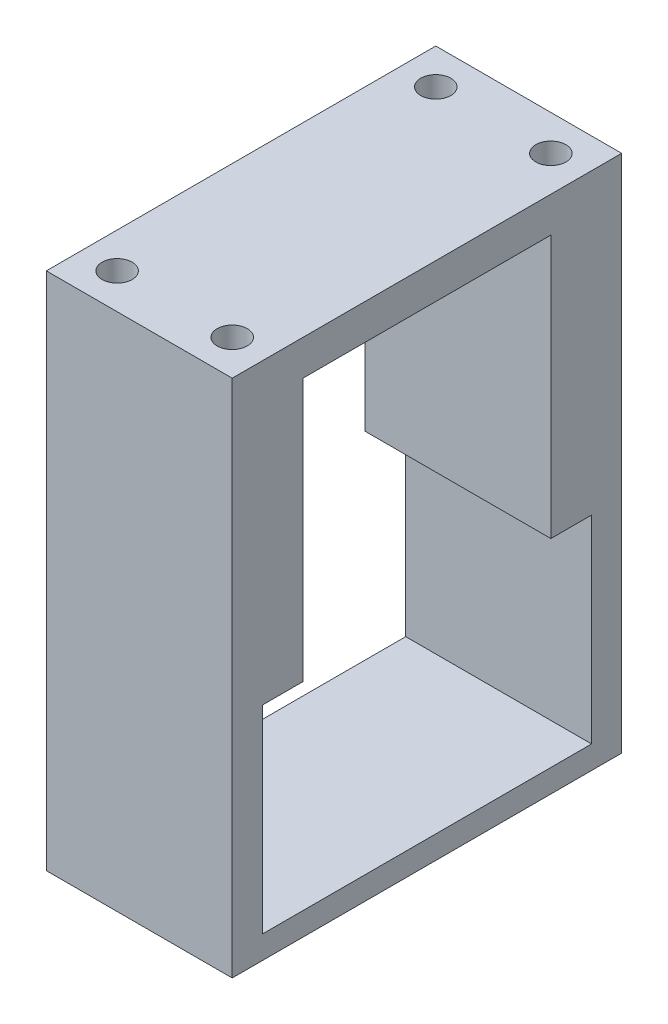
ISO-10303-21;
HEADER;
FILE_DESCRIPTION(('STEP AP214'),'2;1');
FILE_NAME('part.step','',(''),(''),'','','');
FILE_SCHEMA(('AUTOMOTIVE_DESIGN { 1 0 10303 214 1 1 1 1 }'));
ENDSEC;
DATA;
#1=APPLICATION_CONTEXT('core data for automotive mechanical design processes');
#2=APPLICATION_PROTOCOL_DEFINITION('international standard','automotive_design',2000,#1);
#3=PRODUCT_CONTEXT('',#1,'mechanical');
#4=PRODUCT('Part','Part','',(#3));
#5=PRODUCT_RELATED_PRODUCT_CATEGORY('part','',(#4));
#6=PRODUCT_DEFINITION_FORMATION('','',#4);
#7=PRODUCT_DEFINITION_CONTEXT('part definition',#1,'design');
#8=PRODUCT_DEFINITION('design','',#6,#7);
#9=PRODUCT_DEFINITION_SHAPE('','',#8);
#10=(LENGTH_UNIT() NAMED_UNIT(*) SI_UNIT(.MILLI.,.METRE.));
#11=(NAMED_UNIT(*) PLANE_ANGLE_UNIT() SI_UNIT($,.RADIAN.));
#12=(NAMED_UNIT(*) SI_UNIT($,.STERADIAN.) SOLID_ANGLE_UNIT());
#13=UNCERTAINTY_MEASURE_WITH_UNIT(LENGTH_MEASURE(1.E-05),#10,'distance_accuracy_value','');
#14=(GEOMETRIC_REPRESENTATION_CONTEXT(3) GLOBAL_UNCERTAINTY_ASSIGNED_CONTEXT((#13)) GLOBAL_UNIT_ASSIGNED_CONTEXT((#10,
#11,#12)) REPRESENTATION_CONTEXT('',''));
#15=CARTESIAN_POINT('',(0.,0.,0.));
#16=DIRECTION('',(0.,0.,1.));
#17=DIRECTION('',(1.,0.,0.));
#18=AXIS2_PLACEMENT_3D('',#15,#16,#17);
#19=CARTESIAN_POINT('',(200.,518.69,586.32));
#20=DIRECTION('',(0.,-1.,0.));
#21=DIRECTION('',(0.,0.,-1.));
#22=AXIS2_PLACEMENT_3D('',#19,#20,#21);
#23=PLANE('',#22);
#24=CARTESIAN_POINT('',(200.,518.69,586.32));
#25=DIRECTION('',(0.,-1.,0.));
#26=DIRECTION('',(1.,0.,0.));
#27=AXIS2_PLACEMENT_3D('',#24,#25,#26);
#28=CIRCLE('',#27,1.7);
#29=CARTESIAN_POINT('',(201.7,518.69,586.32));
#30=VERTEX_POINT('',#29);
#31=EDGE_CURVE('E9',#30,#30,#28,.T.);
#32=ORIENTED_EDGE('',*,*,#31,.F.);
#33=EDGE_LOOP('',(#32));
#34=FACE_BOUND('',#33,.T.);
#35=ADVANCED_FACE('F15',(#34),#23,.F.);
#36=CARTESIAN_POINT('',(200.,518.69,550.32));
#37=DIRECTION('',(0.,-1.,0.));
#38=DIRECTION('',(0.,0.,-1.));
#39=AXIS2_PLACEMENT_3D('',#36,#37,#38);
#40=PLANE('',#39);
#41=CARTESIAN_POINT('',(200.,518.69,550.32));
#42=DIRECTION('',(0.,-1.,0.));
#43=DIRECTION('',(1.,0.,0.));
#44=AXIS2_PLACEMENT_3D('',#41,#42,#43);
#45=CIRCLE('',#44,1.7);
#46=CARTESIAN_POINT('',(201.7,518.69,550.32));
#47=VERTEX_POINT('',#46);
#48=EDGE_CURVE('E45',#47,#47,#45,.T.);
#49=ORIENTED_EDGE('',*,*,#48,.F.);
#50=EDGE_LOOP('',(#49));
#51=FACE_BOUND('',#50,.T.);
#52=ADVANCED_FACE('F394',(#51),#40,.F.);
#53=CARTESIAN_POINT('',(187.,518.69,586.32));
#54=DIRECTION('',(0.,-1.,0.));
#55=DIRECTION('',(0.,0.,-1.));
#56=AXIS2_PLACEMENT_3D('',#53,#54,#55);
#57=PLANE('',#56);
#58=CARTESIAN_POINT('',(187.,518.69,586.32));
#59=DIRECTION('',(0.,-1.,0.));
#60=DIRECTION('',(1.,0.,0.));
#61=AXIS2_PLACEMENT_3D('',#58,#59,#60);
#62=CIRCLE('',#61,1.7);
#63=CARTESIAN_POINT('',(188.7,518.69,586.32));
#64=VERTEX_POINT('',#63);
#65=EDGE_CURVE('E120',#64,#64,#62,.T.);
#66=ORIENTED_EDGE('',*,*,#65,.F.);
#67=EDGE_LOOP('',(#66));
#68=FACE_BOUND('',#67,.T.);
#69=ADVANCED_FACE('F399',(#68),#57,.F.);
#70=CARTESIAN_POINT('',(187.,518.69,550.32));
#71=DIRECTION('',(0.,-1.,0.));
#72=DIRECTION('',(0.,0.,-1.));
#73=AXIS2_PLACEMENT_3D('',#70,#71,#72);
#74=PLANE('',#73);
#75=CARTESIAN_POINT('',(187.,518.69,550.32));
#76=DIRECTION('',(0.,-1.,0.));
#77=DIRECTION('',(1.,0.,0.));
#78=AXIS2_PLACEMENT_3D('',#75,#76,#77);
#79=CIRCLE('',#78,1.7);
#80=CARTESIAN_POINT('',(188.7,518.69,550.32));
#81=VERTEX_POINT('',#80);
#82=EDGE_CURVE('E108',#81,#81,#79,.T.);
#83=ORIENTED_EDGE('',*,*,#82,.F.);
#84=EDGE_LOOP('',(#83));
#85=FACE_BOUND('',#84,.T.);
#86=ADVANCED_FACE('F417',(#85),#74,.F.);
#87=CARTESIAN_POINT('',(200.,518.69,586.32));
#88=DIRECTION('',(0.,-1.,0.));
#89=DIRECTION('',(1.,0.,0.));
#90=AXIS2_PLACEMENT_3D('',#87,#88,#89);
#91=CYLINDRICAL_SURFACE('',#90,1.7);
#92=DIRECTION('',(0.,1.,0.));
#93=VECTOR('',#92,1.);
#94=CARTESIAN_POINT('',(201.7,518.69,586.32));
#95=LINE('',#94,#93);
#96=CARTESIAN_POINT('',(201.7,524.69,586.32));
#97=VERTEX_POINT('',#96);
#98=EDGE_CURVE('E23',#30,#97,#95,.T.);
#99=ORIENTED_EDGE('',*,*,#98,.T.);
#100=CARTESIAN_POINT('',(200.,524.69,586.32));
#101=DIRECTION('',(0.,-1.,0.));
#102=DIRECTION('',(1.,0.,0.));
#103=AXIS2_PLACEMENT_3D('',#100,#101,#102);
#104=CIRCLE('',#103,1.7);
#105=EDGE_CURVE('E196',#97,#97,#104,.T.);
#106=ORIENTED_EDGE('',*,*,#105,.F.);
#107=ORIENTED_EDGE('',*,*,#98,.F.);
#108=ORIENTED_EDGE('',*,*,#31,.T.);
#109=EDGE_LOOP('',(#99,#106,#107,#108));
#110=FACE_BOUND('',#109,.T.);
#111=ADVANCED_FACE('F401',(#110),#91,.F.);
#112=CARTESIAN_POINT('',(200.,518.69,550.32));
#113=DIRECTION('',(0.,-1.,0.));
#114=DIRECTION('',(1.,0.,0.));
#115=AXIS2_PLACEMENT_3D('',#112,#113,#114);
#116=CYLINDRICAL_SURFACE('',#115,1.7);
#117=DIRECTION('',(0.,1.,0.));
#118=VECTOR('',#117,1.);
#119=CARTESIAN_POINT('',(201.7,518.69,550.32));
#120=LINE('',#119,#118);
#121=CARTESIAN_POINT('',(201.7,524.69,550.32));
#122=VERTEX_POINT('',#121);
#123=EDGE_CURVE('E127',#47,#122,#120,.T.);
#124=ORIENTED_EDGE('',*,*,#123,.T.);
#125=CARTESIAN_POINT('',(200.,524.69,550.32));
#126=DIRECTION('',(0.,-1.,0.));
#127=DIRECTION('',(1.,0.,0.));
#128=AXIS2_PLACEMENT_3D('',#125,#126,#127);
#129=CIRCLE('',#128,1.7);
#130=EDGE_CURVE('E192',#122,#122,#129,.T.);
#131=ORIENTED_EDGE('',*,*,#130,.F.);
#132=ORIENTED_EDGE('',*,*,#123,.F.);
#133=ORIENTED_EDGE('',*,*,#48,.T.);
#134=EDGE_LOOP('',(#124,#131,#132,#133));
#135=FACE_BOUND('',#134,.T.);
#136=ADVANCED_FACE('F426',(#135),#116,.F.);
#137=CARTESIAN_POINT('',(187.,518.69,586.32));
#138=DIRECTION('',(0.,-1.,0.));
#139=DIRECTION('',(1.,0.,0.));
#140=AXIS2_PLACEMENT_3D('',#137,#138,#139);
#141=CYLINDRICAL_SURFACE('',#140,1.7);
#142=DIRECTION('',(0.,1.,0.));
#143=VECTOR('',#142,1.);
#144=CARTESIAN_POINT('',(188.7,518.69,586.32));
#145=LINE('',#144,#143);
#146=CARTESIAN_POINT('',(188.7,524.69,586.32));
#147=VERTEX_POINT('',#146);
#148=EDGE_CURVE('E115',#64,#147,#145,.T.);
#149=ORIENTED_EDGE('',*,*,#148,.T.);
#150=CARTESIAN_POINT('',(187.,524.69,586.32));
#151=DIRECTION('',(0.,-1.,0.));
#152=DIRECTION('',(1.,0.,0.));
#153=AXIS2_PLACEMENT_3D('',#150,#151,#152);
#154=CIRCLE('',#153,1.7);
#155=EDGE_CURVE('E191',#147,#147,#154,.T.);
#156=ORIENTED_EDGE('',*,*,#155,.F.);
#157=ORIENTED_EDGE('',*,*,#148,.F.);
#158=ORIENTED_EDGE('',*,*,#65,.T.);
#159=EDGE_LOOP('',(#149,#156,#157,#158));
#160=FACE_BOUND('',#159,.T.);
#161=ADVANCED_FACE('F413',(#160),#141,.F.);
#162=CARTESIAN_POINT('',(187.,518.69,550.32));
#163=DIRECTION('',(0.,-1.,0.));
#164=DIRECTION('',(1.,0.,0.));
#165=AXIS2_PLACEMENT_3D('',#162,#163,#164);
#166=CYLINDRICAL_SURFACE('',#165,1.7);
#167=DIRECTION('',(0.,1.,0.));
#168=VECTOR('',#167,1.);
#169=CARTESIAN_POINT('',(188.7,518.69,550.32));
#170=LINE('',#169,#168);
#171=CARTESIAN_POINT('',(188.7,524.69,550.32));
#172=VERTEX_POINT('',#171);
#173=EDGE_CURVE('E111',#81,#172,#170,.T.);
#174=ORIENTED_EDGE('',*,*,#173,.T.);
#175=CARTESIAN_POINT('',(187.,524.69,550.32));
#176=DIRECTION('',(0.,-1.,0.));
#177=DIRECTION('',(1.,0.,0.));
#178=AXIS2_PLACEMENT_3D('',#175,#176,#177);
#179=CIRCLE('',#178,1.7);
#180=EDGE_CURVE('E187',#172,#172,#179,.T.);
#181=ORIENTED_EDGE('',*,*,#180,.F.);
#182=ORIENTED_EDGE('',*,*,#173,.F.);
#183=ORIENTED_EDGE('',*,*,#82,.T.);
#184=EDGE_LOOP('',(#174,#181,#182,#183));
#185=FACE_BOUND('',#184,.T.);
#186=ADVANCED_FACE('F109',(#185),#166,.F.);
#187=CARTESIAN_POINT('',(204.,466.,546.32));
#188=DIRECTION('',(1.,0.,0.));
#189=DIRECTION('',(0.,1.,0.));
#190=AXIS2_PLACEMENT_3D('',#187,#188,#189);
#191=PLANE('',#190);
#192=DIRECTION('',(0.,0.,1.));
#193=VECTOR('',#192,1.);
#194=CARTESIAN_POINT('',(204.,491.,548.02));
#195=LINE('',#194,#193);
#196=CARTESIAN_POINT('',(204.,491.,549.72));
#197=VERTEX_POINT('',#196);
#198=CARTESIAN_POINT('',(204.,491.,554.32));
#199=VERTEX_POINT('',#198);
#200=EDGE_CURVE('E199',#197,#199,#195,.T.);
#201=ORIENTED_EDGE('',*,*,#200,.F.);
#202=DIRECTION('',(0.,-1.,0.));
#203=VECTOR('',#202,1.);
#204=CARTESIAN_POINT('',(204.,467.3,549.72));
#205=LINE('',#204,#203);
#206=CARTESIAN_POINT('',(204.,468.6,549.72));
#207=VERTEX_POINT('',#206);
#208=EDGE_CURVE('E122',#197,#207,#205,.T.);
#209=ORIENTED_EDGE('',*,*,#208,.T.);
#210=DIRECTION('',(0.,0.,1.));
#211=VECTOR('',#210,1.);
#212=CARTESIAN_POINT('',(204.,468.6,548.02));
#213=LINE('',#212,#211);
#214=CARTESIAN_POINT('',(204.,468.6,586.92));
#215=VERTEX_POINT('',#214);
#216=EDGE_CURVE('E242',#207,#215,#213,.T.);
#217=ORIENTED_EDGE('',*,*,#216,.T.);
#218=DIRECTION('',(0.,-1.,0.));
#219=VECTOR('',#218,1.);
#220=CARTESIAN_POINT('',(204.,467.3,586.92));
#221=LINE('',#220,#219);
#222=CARTESIAN_POINT('',(204.,491.,586.92));
#223=VERTEX_POINT('',#222);
#224=EDGE_CURVE('E166',#223,#215,#221,.T.);
#225=ORIENTED_EDGE('',*,*,#224,.F.);
#226=DIRECTION('',(0.,0.,1.));
#227=VECTOR('',#226,1.);
#228=CARTESIAN_POINT('',(204.,491.,548.02));
#229=LINE('',#228,#227);
#230=CARTESIAN_POINT('',(204.,491.,582.32));
#231=VERTEX_POINT('',#230);
#232=EDGE_CURVE('E234',#231,#223,#229,.T.);
#233=ORIENTED_EDGE('',*,*,#232,.F.);
#234=DIRECTION('',(0.,-1.,0.));
#235=VECTOR('',#234,1.);
#236=CARTESIAN_POINT('',(204.,478.45,582.32));
#237=LINE('',#236,#235);
#238=CARTESIAN_POINT('',(204.,520.69,582.32));
#239=VERTEX_POINT('',#238);
#240=EDGE_CURVE('E226',#239,#231,#237,.T.);
#241=ORIENTED_EDGE('',*,*,#240,.F.);
#242=DIRECTION('',(0.,0.,1.));
#243=VECTOR('',#242,1.);
#244=CARTESIAN_POINT('',(204.,520.69,550.32));
#245=LINE('',#244,#243);
#246=CARTESIAN_POINT('',(204.,520.69,554.32));
#247=VERTEX_POINT('',#246);
#248=EDGE_CURVE('E218',#247,#239,#245,.T.);
#249=ORIENTED_EDGE('',*,*,#248,.F.);
#250=DIRECTION('',(0.,-1.,0.));
#251=VECTOR('',#250,1.);
#252=CARTESIAN_POINT('',(204.,478.45,554.32));
#253=LINE('',#252,#251);
#254=EDGE_CURVE('E215',#247,#199,#253,.T.);
#255=ORIENTED_EDGE('',*,*,#254,.T.);
#256=EDGE_LOOP('',(#201,#209,#217,#225,#233,#241,#249,#255));
#257=FACE_BOUND('',#256,.T.);
#258=DIRECTION('',(0.,0.,1.));
#259=VECTOR('',#258,1.);
#260=CARTESIAN_POINT('',(204.,466.,546.32));
#261=LINE('',#260,#259);
#262=CARTESIAN_POINT('',(204.,466.,546.32));
#263=VERTEX_POINT('',#262);
#264=CARTESIAN_POINT('',(204.,466.,590.32));
#265=VERTEX_POINT('',#264);
#266=EDGE_CURVE('E157',#263,#265,#261,.T.);
#267=ORIENTED_EDGE('',*,*,#266,.F.);
#268=DIRECTION('',(0.,1.,0.));
#269=VECTOR('',#268,1.);
#270=CARTESIAN_POINT('',(204.,466.,546.32));
#271=LINE('',#270,#269);
#272=CARTESIAN_POINT('',(204.,524.69,546.32));
#273=VERTEX_POINT('',#272);
#274=EDGE_CURVE('E181',#263,#273,#271,.T.);
#275=ORIENTED_EDGE('',*,*,#274,.T.);
#276=DIRECTION('',(0.,0.,1.));
#277=VECTOR('',#276,1.);
#278=CARTESIAN_POINT('',(204.,524.69,546.32));
#279=LINE('',#278,#277);
#280=CARTESIAN_POINT('',(204.,524.69,590.32));
#281=VERTEX_POINT('',#280);
#282=EDGE_CURVE('E185',#273,#281,#279,.T.);
#283=ORIENTED_EDGE('',*,*,#282,.T.);
#284=DIRECTION('',(0.,1.,0.));
#285=VECTOR('',#284,1.);
#286=CARTESIAN_POINT('',(204.,466.,590.32));
#287=LINE('',#286,#285);
#288=EDGE_CURVE('E146',#265,#281,#287,.T.);
#289=ORIENTED_EDGE('',*,*,#288,.F.);
#290=EDGE_LOOP('',(#267,#275,#283,#289));
#291=FACE_BOUND('',#290,.T.);
#292=ADVANCED_FACE('F255',(#257,#291),#191,.T.);
#293=CARTESIAN_POINT('',(181.,468.6,549.72));
#294=DIRECTION('',(0.,0.,1.));
#295=DIRECTION('',(1.,0.,0.));
#296=AXIS2_PLACEMENT_3D('',#293,#294,#295);
#297=PLANE('',#296);
#298=DIRECTION('',(1.,0.,0.));
#299=VECTOR('',#298,1.);
#300=CARTESIAN_POINT('',(181.,491.,549.72));
#301=LINE('',#300,#299);
#302=CARTESIAN_POINT('',(183.,491.,549.72));
#303=VERTEX_POINT('',#302);
#304=EDGE_CURVE('E207',#303,#197,#301,.T.);
#305=ORIENTED_EDGE('',*,*,#304,.F.);
#306=DIRECTION('',(0.,-1.,0.));
#307=VECTOR('',#306,1.);
#308=CARTESIAN_POINT('',(183.,467.3,549.72));
#309=LINE('',#308,#307);
#310=CARTESIAN_POINT('',(183.,468.6,549.72));
#311=VERTEX_POINT('',#310);
#312=EDGE_CURVE('E148',#303,#311,#309,.T.);
#313=ORIENTED_EDGE('',*,*,#312,.T.);
#314=DIRECTION('',(1.,0.,0.));
#315=VECTOR('',#314,1.);
#316=CARTESIAN_POINT('',(181.,468.6,549.72));
#317=LINE('',#316,#315);
#318=EDGE_CURVE('E165',#311,#207,#317,.T.);
#319=ORIENTED_EDGE('',*,*,#318,.T.);
#320=ORIENTED_EDGE('',*,*,#208,.F.);
#321=EDGE_LOOP('',(#305,#313,#319,#320));
#322=FACE_BOUND('',#321,.T.);
#323=ADVANCED_FACE('F265',(#322),#297,.T.);
#324=CARTESIAN_POINT('',(181.,468.6,549.72));
#325=DIRECTION('',(0.,1.,0.));
#326=DIRECTION('',(1.,0.,0.));
#327=AXIS2_PLACEMENT_3D('',#324,#325,#326);
#328=PLANE('',#327);
#329=ORIENTED_EDGE('',*,*,#318,.F.);
#330=DIRECTION('',(0.,0.,1.));
#331=VECTOR('',#330,1.);
#332=CARTESIAN_POINT('',(183.,468.6,548.02));
#333=LINE('',#332,#331);
#334=CARTESIAN_POINT('',(183.,468.6,586.92));
#335=VERTEX_POINT('',#334);
#336=EDGE_CURVE('E153',#311,#335,#333,.T.);
#337=ORIENTED_EDGE('',*,*,#336,.T.);
#338=DIRECTION('',(1.,0.,0.));
#339=VECTOR('',#338,1.);
#340=CARTESIAN_POINT('',(181.,468.6,586.92));
#341=LINE('',#340,#339);
#342=EDGE_CURVE('E161',#335,#215,#341,.T.);
#343=ORIENTED_EDGE('',*,*,#342,.T.);
#344=ORIENTED_EDGE('',*,*,#216,.F.);
#345=EDGE_LOOP('',(#329,#337,#343,#344));
#346=FACE_BOUND('',#345,.T.);
#347=ADVANCED_FACE('F261',(#346),#328,.T.);
#348=CARTESIAN_POINT('',(181.,468.6,586.92));
#349=DIRECTION('',(0.,0.,1.));
#350=DIRECTION('',(1.,0.,0.));
#351=AXIS2_PLACEMENT_3D('',#348,#349,#350);
#352=PLANE('',#351);
#353=ORIENTED_EDGE('',*,*,#224,.T.);
#354=ORIENTED_EDGE('',*,*,#342,.F.);
#355=DIRECTION('',(0.,-1.,0.));
#356=VECTOR('',#355,1.);
#357=CARTESIAN_POINT('',(183.,467.3,586.92));
#358=LINE('',#357,#356);
#359=CARTESIAN_POINT('',(183.,491.,586.92));
#360=VERTEX_POINT('',#359);
#361=EDGE_CURVE('E141',#360,#335,#358,.T.);
#362=ORIENTED_EDGE('',*,*,#361,.F.);
#363=DIRECTION('',(1.,0.,0.));
#364=VECTOR('',#363,1.);
#365=CARTESIAN_POINT('',(181.,491.,586.92));
#366=LINE('',#365,#364);
#367=EDGE_CURVE('E238',#360,#223,#366,.T.);
#368=ORIENTED_EDGE('',*,*,#367,.T.);
#369=EDGE_LOOP('',(#353,#354,#362,#368));
#370=FACE_BOUND('',#369,.T.);
#371=ADVANCED_FACE('F435',(#370),#352,.F.);
#372=CARTESIAN_POINT('',(181.,491.,549.72));
#373=DIRECTION('',(0.,1.,0.));
#374=DIRECTION('',(1.,0.,0.));
#375=AXIS2_PLACEMENT_3D('',#372,#373,#374);
#376=PLANE('',#375);
#377=ORIENTED_EDGE('',*,*,#232,.T.);
#378=ORIENTED_EDGE('',*,*,#367,.F.);
#379=DIRECTION('',(0.,0.,1.));
#380=VECTOR('',#379,1.);
#381=CARTESIAN_POINT('',(183.,491.,548.02));
#382=LINE('',#381,#380);
#383=CARTESIAN_POINT('',(183.,491.,582.32));
#384=VERTEX_POINT('',#383);
#385=EDGE_CURVE('E283',#384,#360,#382,.T.);
#386=ORIENTED_EDGE('',*,*,#385,.F.);
#387=DIRECTION('',(1.,0.,0.));
#388=VECTOR('',#387,1.);
#389=CARTESIAN_POINT('',(181.,491.,582.32));
#390=LINE('',#389,#388);
#391=EDGE_CURVE('E230',#384,#231,#390,.T.);
#392=ORIENTED_EDGE('',*,*,#391,.T.);
#393=EDGE_LOOP('',(#377,#378,#386,#392));
#394=FACE_BOUND('',#393,.T.);
#395=ADVANCED_FACE('F438',(#394),#376,.F.);
#396=CARTESIAN_POINT('',(181.,490.9,582.32));
#397=DIRECTION('',(0.,0.,1.));
#398=DIRECTION('',(1.,0.,0.));
#399=AXIS2_PLACEMENT_3D('',#396,#397,#398);
#400=PLANE('',#399);
#401=ORIENTED_EDGE('',*,*,#240,.T.);
#402=ORIENTED_EDGE('',*,*,#391,.F.);
#403=DIRECTION('',(0.,-1.,0.));
#404=VECTOR('',#403,1.);
#405=CARTESIAN_POINT('',(183.,478.45,582.32));
#406=LINE('',#405,#404);
#407=CARTESIAN_POINT('',(183.,520.69,582.32));
#408=VERTEX_POINT('',#407);
#409=EDGE_CURVE('E285',#408,#384,#406,.T.);
#410=ORIENTED_EDGE('',*,*,#409,.F.);
#411=DIRECTION('',(1.,0.,0.));
#412=VECTOR('',#411,1.);
#413=CARTESIAN_POINT('',(181.,520.69,582.32));
#414=LINE('',#413,#412);
#415=EDGE_CURVE('E222',#408,#239,#414,.T.);
#416=ORIENTED_EDGE('',*,*,#415,.T.);
#417=EDGE_LOOP('',(#401,#402,#410,#416));
#418=FACE_BOUND('',#417,.T.);
#419=ADVANCED_FACE('F442',(#418),#400,.F.);
#420=CARTESIAN_POINT('',(181.,520.69,554.32));
#421=DIRECTION('',(0.,1.,0.));
#422=DIRECTION('',(1.,0.,0.));
#423=AXIS2_PLACEMENT_3D('',#420,#421,#422);
#424=PLANE('',#423);
#425=ORIENTED_EDGE('',*,*,#248,.T.);
#426=ORIENTED_EDGE('',*,*,#415,.F.);
#427=DIRECTION('',(0.,0.,1.));
#428=VECTOR('',#427,1.);
#429=CARTESIAN_POINT('',(183.,520.69,550.32));
#430=LINE('',#429,#428);
#431=CARTESIAN_POINT('',(183.,520.69,554.32));
#432=VERTEX_POINT('',#431);
#433=EDGE_CURVE('E288',#432,#408,#430,.T.);
#434=ORIENTED_EDGE('',*,*,#433,.F.);
#435=DIRECTION('',(1.,0.,0.));
#436=VECTOR('',#435,1.);
#437=CARTESIAN_POINT('',(181.,520.69,554.32));
#438=LINE('',#437,#436);
#439=EDGE_CURVE('E211',#432,#247,#438,.T.);
#440=ORIENTED_EDGE('',*,*,#439,.T.);
#441=EDGE_LOOP('',(#425,#426,#434,#440));
#442=FACE_BOUND('',#441,.T.);
#443=ADVANCED_FACE('F446',(#442),#424,.F.);
#444=CARTESIAN_POINT('',(181.,490.9,554.32));
#445=DIRECTION('',(0.,0.,1.));
#446=DIRECTION('',(1.,0.,0.));
#447=AXIS2_PLACEMENT_3D('',#444,#445,#446);
#448=PLANE('',#447);
#449=ORIENTED_EDGE('',*,*,#439,.F.);
#450=DIRECTION('',(0.,-1.,0.));
#451=VECTOR('',#450,1.);
#452=CARTESIAN_POINT('',(183.,478.45,554.32));
#453=LINE('',#452,#451);
#454=CARTESIAN_POINT('',(183.,491.,554.32));
#455=VERTEX_POINT('',#454);
#456=EDGE_CURVE('E292',#432,#455,#453,.T.);
#457=ORIENTED_EDGE('',*,*,#456,.T.);
#458=DIRECTION('',(1.,0.,0.));
#459=VECTOR('',#458,1.);
#460=CARTESIAN_POINT('',(181.,491.,554.32));
#461=LINE('',#460,#459);
#462=EDGE_CURVE('E203',#455,#199,#461,.T.);
#463=ORIENTED_EDGE('',*,*,#462,.T.);
#464=ORIENTED_EDGE('',*,*,#254,.F.);
#465=EDGE_LOOP('',(#449,#457,#463,#464));
#466=FACE_BOUND('',#465,.T.);
#467=ADVANCED_FACE('F448',(#466),#448,.T.);
#468=CARTESIAN_POINT('',(181.,491.,549.72));
#469=DIRECTION('',(0.,1.,0.));
#470=DIRECTION('',(1.,0.,0.));
#471=AXIS2_PLACEMENT_3D('',#468,#469,#470);
#472=PLANE('',#471);
#473=ORIENTED_EDGE('',*,*,#200,.T.);
#474=ORIENTED_EDGE('',*,*,#462,.F.);
#475=DIRECTION('',(0.,0.,1.));
#476=VECTOR('',#475,1.);
#477=CARTESIAN_POINT('',(183.,491.,548.02));
#478=LINE('',#477,#476);
#479=EDGE_CURVE('E152',#303,#455,#478,.T.);
#480=ORIENTED_EDGE('',*,*,#479,.F.);
#481=ORIENTED_EDGE('',*,*,#304,.T.);
#482=EDGE_LOOP('',(#473,#474,#480,#481));
#483=FACE_BOUND('',#482,.T.);
#484=ADVANCED_FACE('F405',(#483),#472,.F.);
#485=CARTESIAN_POINT('',(183.,524.69,546.32));
#486=DIRECTION('',(0.,1.,0.));
#487=DIRECTION('',(1.,0.,0.));
#488=AXIS2_PLACEMENT_3D('',#485,#486,#487);
#489=PLANE('',#488);
#490=ORIENTED_EDGE('',*,*,#105,.T.);
#491=EDGE_LOOP('',(#490));
#492=FACE_BOUND('',#491,.T.);
#493=ORIENTED_EDGE('',*,*,#130,.T.);
#494=EDGE_LOOP('',(#493));
#495=FACE_BOUND('',#494,.T.);
#496=ORIENTED_EDGE('',*,*,#155,.T.);
#497=EDGE_LOOP('',(#496));
#498=FACE_BOUND('',#497,.T.);
#499=ORIENTED_EDGE('',*,*,#180,.T.);
#500=EDGE_LOOP('',(#499));
#501=FACE_BOUND('',#500,.T.);
#502=DIRECTION('',(1.,0.,0.));
#503=VECTOR('',#502,1.);
#504=CARTESIAN_POINT('',(183.,524.69,546.32));
#505=LINE('',#504,#503);
#506=CARTESIAN_POINT('',(183.,524.69,546.32));
#507=VERTEX_POINT('',#506);
#508=EDGE_CURVE('E177',#507,#273,#505,.T.);
#509=ORIENTED_EDGE('',*,*,#508,.F.);
#510=DIRECTION('',(0.,0.,1.));
#511=VECTOR('',#510,1.);
#512=CARTESIAN_POINT('',(183.,524.69,546.32));
#513=LINE('',#512,#511);
#514=CARTESIAN_POINT('',(183.,524.69,590.32));
#515=VERTEX_POINT('',#514);
#516=EDGE_CURVE('E309',#507,#515,#513,.T.);
#517=ORIENTED_EDGE('',*,*,#516,.T.);
#518=DIRECTION('',(1.,0.,0.));
#519=VECTOR('',#518,1.);
#520=CARTESIAN_POINT('',(183.,524.69,590.32));
#521=LINE('',#520,#519);
#522=EDGE_CURVE('E170',#515,#281,#521,.T.);
#523=ORIENTED_EDGE('',*,*,#522,.T.);
#524=ORIENTED_EDGE('',*,*,#282,.F.);
#525=EDGE_LOOP('',(#509,#517,#523,#524));
#526=FACE_BOUND('',#525,.T.);
#527=ADVANCED_FACE('F380',(#492,#495,#498,#501,#526),#489,.T.);
#528=CARTESIAN_POINT('',(183.,466.,546.32));
#529=DIRECTION('',(0.,0.,1.));
#530=DIRECTION('',(1.,0.,0.));
#531=AXIS2_PLACEMENT_3D('',#528,#529,#530);
#532=PLANE('',#531);
#533=ORIENTED_EDGE('',*,*,#508,.T.);
#534=ORIENTED_EDGE('',*,*,#274,.F.);
#535=DIRECTION('',(1.,0.,0.));
#536=VECTOR('',#535,1.);
#537=CARTESIAN_POINT('',(183.,466.,546.32));
#538=LINE('',#537,#536);
#539=CARTESIAN_POINT('',(183.,466.,546.32));
#540=VERTEX_POINT('',#539);
#541=EDGE_CURVE('E143',#540,#263,#538,.T.);
#542=ORIENTED_EDGE('',*,*,#541,.F.);
#543=DIRECTION('',(0.,1.,0.));
#544=VECTOR('',#543,1.);
#545=CARTESIAN_POINT('',(183.,466.,546.32));
#546=LINE('',#545,#544);
#547=EDGE_CURVE('E302',#540,#507,#546,.T.);
#548=ORIENTED_EDGE('',*,*,#547,.T.);
#549=EDGE_LOOP('',(#533,#534,#542,#548));
#550=FACE_BOUND('',#549,.T.);
#551=ADVANCED_FACE('F382',(#550),#532,.F.);
#552=CARTESIAN_POINT('',(183.,466.,590.32));
#553=DIRECTION('',(0.,0.,1.));
#554=DIRECTION('',(1.,0.,0.));
#555=AXIS2_PLACEMENT_3D('',#552,#553,#554);
#556=PLANE('',#555);
#557=DIRECTION('',(0.,1.,0.));
#558=VECTOR('',#557,1.);
#559=CARTESIAN_POINT('',(183.,466.,590.32));
#560=LINE('',#559,#558);
#561=CARTESIAN_POINT('',(183.,466.,590.32));
#562=VERTEX_POINT('',#561);
#563=EDGE_CURVE('E313',#562,#515,#560,.T.);
#564=ORIENTED_EDGE('',*,*,#563,.F.);
#565=DIRECTION('',(1.,0.,0.));
#566=VECTOR('',#565,1.);
#567=CARTESIAN_POINT('',(183.,466.,590.32));
#568=LINE('',#567,#566);
#569=EDGE_CURVE('E147',#562,#265,#568,.T.);
#570=ORIENTED_EDGE('',*,*,#569,.T.);
#571=ORIENTED_EDGE('',*,*,#288,.T.);
#572=ORIENTED_EDGE('',*,*,#522,.F.);
#573=EDGE_LOOP('',(#564,#570,#571,#572));
#574=FACE_BOUND('',#573,.T.);
#575=ADVANCED_FACE('F328',(#574),#556,.T.);
#576=CARTESIAN_POINT('',(183.,466.,546.32));
#577=DIRECTION('',(0.,1.,0.));
#578=DIRECTION('',(1.,0.,0.));
#579=AXIS2_PLACEMENT_3D('',#576,#577,#578);
#580=PLANE('',#579);
#581=ORIENTED_EDGE('',*,*,#266,.T.);
#582=ORIENTED_EDGE('',*,*,#569,.F.);
#583=DIRECTION('',(0.,0.,1.));
#584=VECTOR('',#583,1.);
#585=CARTESIAN_POINT('',(183.,466.,546.32));
#586=LINE('',#585,#584);
#587=EDGE_CURVE('E296',#540,#562,#586,.T.);
#588=ORIENTED_EDGE('',*,*,#587,.F.);
#589=ORIENTED_EDGE('',*,*,#541,.T.);
#590=EDGE_LOOP('',(#581,#582,#588,#589));
#591=FACE_BOUND('',#590,.T.);
#592=ADVANCED_FACE('F383',(#591),#580,.F.);
#593=CARTESIAN_POINT('',(183.,466.,546.32));
#594=DIRECTION('',(1.,0.,0.));
#595=DIRECTION('',(0.,1.,0.));
#596=AXIS2_PLACEMENT_3D('',#593,#594,#595);
#597=PLANE('',#596);
#598=ORIENTED_EDGE('',*,*,#456,.F.);
#599=ORIENTED_EDGE('',*,*,#433,.T.);
#600=ORIENTED_EDGE('',*,*,#409,.T.);
#601=ORIENTED_EDGE('',*,*,#385,.T.);
#602=ORIENTED_EDGE('',*,*,#361,.T.);
#603=ORIENTED_EDGE('',*,*,#336,.F.);
#604=ORIENTED_EDGE('',*,*,#312,.F.);
#605=ORIENTED_EDGE('',*,*,#479,.T.);
#606=EDGE_LOOP('',(#598,#599,#600,#601,#602,#603,#604,#605));
#607=FACE_BOUND('',#606,.T.);
#608=ORIENTED_EDGE('',*,*,#563,.T.);
#609=ORIENTED_EDGE('',*,*,#516,.F.);
#610=ORIENTED_EDGE('',*,*,#547,.F.);
#611=ORIENTED_EDGE('',*,*,#587,.T.);
#612=EDGE_LOOP('',(#608,#609,#610,#611));
#613=FACE_BOUND('',#612,.T.);
#614=ADVANCED_FACE('F276',(#607,#613),#597,.F.);
#615=CLOSED_SHELL('',(#35,#52,#69,#86,#111,#136,#161,#186,#292,#323,#347,#371,#395,#419,#443,
#467,#484,#527,#551,#575,#592,#614));
#616=MANIFOLD_SOLID_BREP('B1',#615);
#617=ADVANCED_BREP_SHAPE_REPRESENTATION('',(#18,#616),#14);
#618=SHAPE_DEFINITION_REPRESENTATION(#9,#617);
ENDSEC;
END-ISO-10303-21;
